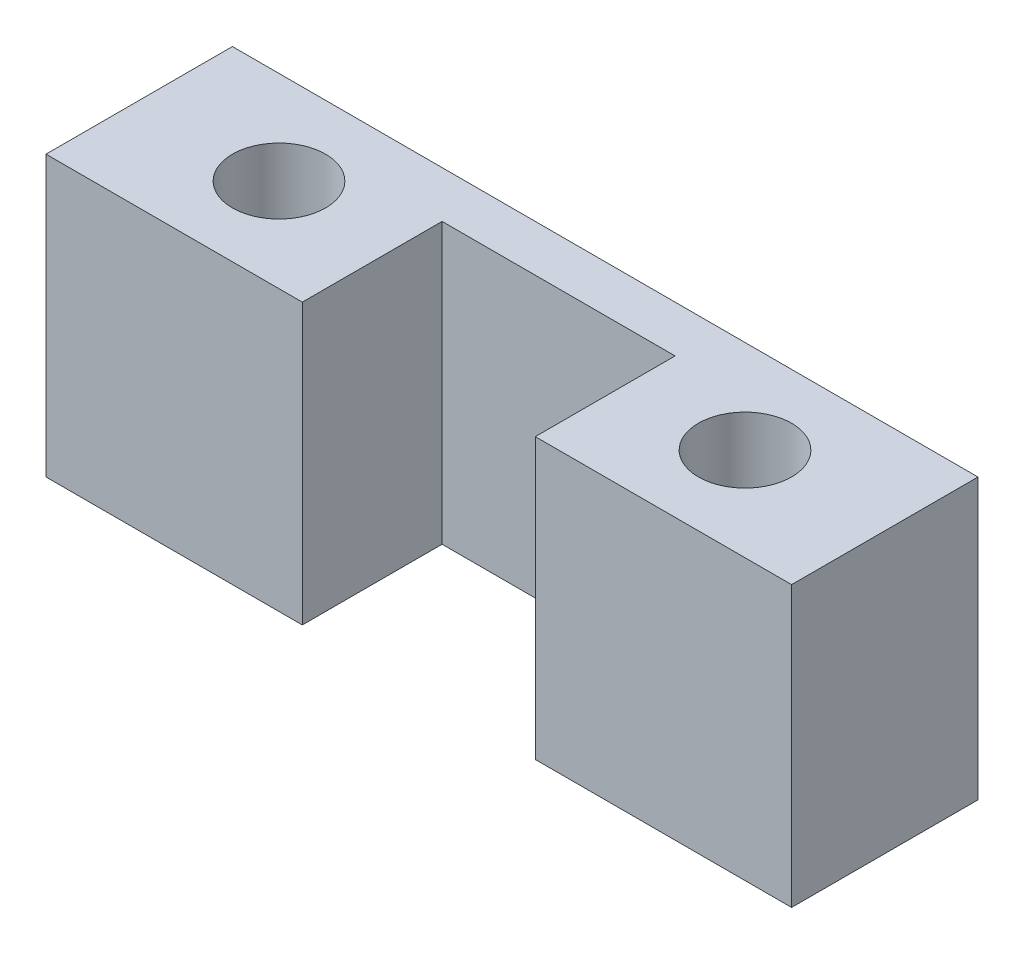
ISO-10303-21;
HEADER;
FILE_DESCRIPTION(('STEP AP214'),'2;1');
FILE_NAME('part.step','',(''),(''),'','','');
FILE_SCHEMA(('AUTOMOTIVE_DESIGN { 1 0 10303 214 1 1 1 1 }'));
ENDSEC;
DATA;
#1=APPLICATION_CONTEXT('core data for automotive mechanical design processes');
#2=APPLICATION_PROTOCOL_DEFINITION('international standard','automotive_design',2000,#1);
#3=PRODUCT_CONTEXT('',#1,'mechanical');
#4=PRODUCT('Part','Part','',(#3));
#5=PRODUCT_RELATED_PRODUCT_CATEGORY('part','',(#4));
#6=PRODUCT_DEFINITION_FORMATION('','',#4);
#7=PRODUCT_DEFINITION_CONTEXT('part definition',#1,'design');
#8=PRODUCT_DEFINITION('design','',#6,#7);
#9=PRODUCT_DEFINITION_SHAPE('','',#8);
#10=(LENGTH_UNIT() NAMED_UNIT(*) SI_UNIT(.MILLI.,.METRE.));
#11=(NAMED_UNIT(*) PLANE_ANGLE_UNIT() SI_UNIT($,.RADIAN.));
#12=(NAMED_UNIT(*) SI_UNIT($,.STERADIAN.) SOLID_ANGLE_UNIT());
#13=UNCERTAINTY_MEASURE_WITH_UNIT(LENGTH_MEASURE(1.E-05),#10,'distance_accuracy_value','');
#14=(GEOMETRIC_REPRESENTATION_CONTEXT(3) GLOBAL_UNCERTAINTY_ASSIGNED_CONTEXT((#13)) GLOBAL_UNIT_ASSIGNED_CONTEXT((#10,
#11,#12)) REPRESENTATION_CONTEXT('',''));
#15=CARTESIAN_POINT('',(0.,0.,0.));
#16=DIRECTION('',(0.,0.,1.));
#17=DIRECTION('',(1.,0.,0.));
#18=AXIS2_PLACEMENT_3D('',#15,#16,#17);
#19=CARTESIAN_POINT('',(-25.4,19.05,6.35));
#20=DIRECTION('',(0.,0.,-1.));
#21=DIRECTION('',(-1.,0.,0.));
#22=AXIS2_PLACEMENT_3D('',#19,#20,#21);
#23=PLANE('',#22);
#24=DIRECTION('',(1.,0.,0.));
#25=VECTOR('',#24,1.);
#26=CARTESIAN_POINT('',(-25.4,0.,6.35));
#27=LINE('',#26,#25);
#28=CARTESIAN_POINT('',(-25.4,0.,6.35));
#29=VERTEX_POINT('',#28);
#30=CARTESIAN_POINT('',(-7.9375,0.,6.35));
#31=VERTEX_POINT('',#30);
#32=EDGE_CURVE('E132',#29,#31,#27,.T.);
#33=ORIENTED_EDGE('',*,*,#32,.T.);
#34=DIRECTION('',(0.,1.,0.));
#35=VECTOR('',#34,1.);
#36=CARTESIAN_POINT('',(-7.9375,0.,6.35));
#37=LINE('',#36,#35);
#38=CARTESIAN_POINT('',(-7.9375,19.05,6.35));
#39=VERTEX_POINT('',#38);
#40=EDGE_CURVE('E115',#31,#39,#37,.T.);
#41=ORIENTED_EDGE('',*,*,#40,.T.);
#42=DIRECTION('',(1.,0.,0.));
#43=VECTOR('',#42,1.);
#44=CARTESIAN_POINT('',(-25.4,19.05,6.35));
#45=LINE('',#44,#43);
#46=CARTESIAN_POINT('',(-25.4,19.05,6.35));
#47=VERTEX_POINT('',#46);
#48=EDGE_CURVE('E154',#47,#39,#45,.T.);
#49=ORIENTED_EDGE('',*,*,#48,.F.);
#50=DIRECTION('',(0.,-1.,0.));
#51=VECTOR('',#50,1.);
#52=CARTESIAN_POINT('',(-25.4,19.05,6.35));
#53=LINE('',#52,#51);
#54=EDGE_CURVE('E140',#47,#29,#53,.T.);
#55=ORIENTED_EDGE('',*,*,#54,.T.);
#56=EDGE_LOOP('',(#33,#41,#49,#55));
#57=FACE_BOUND('',#56,.T.);
#58=ADVANCED_FACE('F39',(#57),#23,.F.);
#59=CARTESIAN_POINT('',(25.4,19.05,6.35));
#60=DIRECTION('',(-1.,0.,0.));
#61=DIRECTION('',(0.,0.,1.));
#62=AXIS2_PLACEMENT_3D('',#59,#60,#61);
#63=PLANE('',#62);
#64=DIRECTION('',(0.,0.,-1.));
#65=VECTOR('',#64,1.);
#66=CARTESIAN_POINT('',(25.4,0.,6.35));
#67=LINE('',#66,#65);
#68=CARTESIAN_POINT('',(25.4,0.,6.35));
#69=VERTEX_POINT('',#68);
#70=CARTESIAN_POINT('',(25.4,0.,-6.35));
#71=VERTEX_POINT('',#70);
#72=EDGE_CURVE('E166',#69,#71,#67,.T.);
#73=ORIENTED_EDGE('',*,*,#72,.T.);
#74=DIRECTION('',(0.,-1.,0.));
#75=VECTOR('',#74,1.);
#76=CARTESIAN_POINT('',(25.4,19.05,-6.35));
#77=LINE('',#76,#75);
#78=CARTESIAN_POINT('',(25.4,19.05,-6.35));
#79=VERTEX_POINT('',#78);
#80=EDGE_CURVE('E11',#79,#71,#77,.T.);
#81=ORIENTED_EDGE('',*,*,#80,.F.);
#82=DIRECTION('',(0.,0.,-1.));
#83=VECTOR('',#82,1.);
#84=CARTESIAN_POINT('',(25.4,19.05,6.35));
#85=LINE('',#84,#83);
#86=CARTESIAN_POINT('',(25.4,19.05,6.35));
#87=VERTEX_POINT('',#86);
#88=EDGE_CURVE('E142',#87,#79,#85,.T.);
#89=ORIENTED_EDGE('',*,*,#88,.F.);
#90=DIRECTION('',(0.,-1.,0.));
#91=VECTOR('',#90,1.);
#92=CARTESIAN_POINT('',(25.4,19.05,6.35));
#93=LINE('',#92,#91);
#94=EDGE_CURVE('E151',#87,#69,#93,.T.);
#95=ORIENTED_EDGE('',*,*,#94,.T.);
#96=EDGE_LOOP('',(#73,#81,#89,#95));
#97=FACE_BOUND('',#96,.T.);
#98=ADVANCED_FACE('F41',(#97),#63,.F.);
#99=CARTESIAN_POINT('',(-25.4,19.05,-6.35));
#100=DIRECTION('',(0.,0.,1.));
#101=DIRECTION('',(1.,0.,0.));
#102=AXIS2_PLACEMENT_3D('',#99,#100,#101);
#103=PLANE('',#102);
#104=DIRECTION('',(-1.,0.,0.));
#105=VECTOR('',#104,1.);
#106=CARTESIAN_POINT('',(-25.4,0.,-6.35));
#107=LINE('',#106,#105);
#108=CARTESIAN_POINT('',(-25.4,0.,-6.35));
#109=VERTEX_POINT('',#108);
#110=EDGE_CURVE('E163',#71,#109,#107,.T.);
#111=ORIENTED_EDGE('',*,*,#110,.T.);
#112=DIRECTION('',(0.,-1.,0.));
#113=VECTOR('',#112,1.);
#114=CARTESIAN_POINT('',(-25.4,19.05,-6.35));
#115=LINE('',#114,#113);
#116=CARTESIAN_POINT('',(-25.4,19.05,-6.35));
#117=VERTEX_POINT('',#116);
#118=EDGE_CURVE('E48',#117,#109,#115,.T.);
#119=ORIENTED_EDGE('',*,*,#118,.F.);
#120=DIRECTION('',(-1.,0.,0.));
#121=VECTOR('',#120,1.);
#122=CARTESIAN_POINT('',(-25.4,19.05,-6.35));
#123=LINE('',#122,#121);
#124=EDGE_CURVE('E93',#79,#117,#123,.T.);
#125=ORIENTED_EDGE('',*,*,#124,.F.);
#126=ORIENTED_EDGE('',*,*,#80,.T.);
#127=EDGE_LOOP('',(#111,#119,#125,#126));
#128=FACE_BOUND('',#127,.T.);
#129=ADVANCED_FACE('F237',(#128),#103,.F.);
#130=CARTESIAN_POINT('',(-25.4,19.05,6.35));
#131=DIRECTION('',(1.,0.,0.));
#132=DIRECTION('',(0.,0.,-1.));
#133=AXIS2_PLACEMENT_3D('',#130,#131,#132);
#134=PLANE('',#133);
#135=DIRECTION('',(0.,0.,1.));
#136=VECTOR('',#135,1.);
#137=CARTESIAN_POINT('',(-25.4,0.,6.35));
#138=LINE('',#137,#136);
#139=EDGE_CURVE('E147',#109,#29,#138,.T.);
#140=ORIENTED_EDGE('',*,*,#139,.T.);
#141=ORIENTED_EDGE('',*,*,#54,.F.);
#142=DIRECTION('',(0.,0.,1.));
#143=VECTOR('',#142,1.);
#144=CARTESIAN_POINT('',(-25.4,19.05,6.35));
#145=LINE('',#144,#143);
#146=EDGE_CURVE('E161',#117,#47,#145,.T.);
#147=ORIENTED_EDGE('',*,*,#146,.F.);
#148=ORIENTED_EDGE('',*,*,#118,.T.);
#149=EDGE_LOOP('',(#140,#141,#147,#148));
#150=FACE_BOUND('',#149,.T.);
#151=ADVANCED_FACE('F160',(#150),#134,.F.);
#152=CARTESIAN_POINT('',(7.9375,19.05,6.35));
#153=VERTEX_POINT('',#152);
#154=EDGE_CURVE('E64',#153,#87,#45,.T.);
#155=ORIENTED_EDGE('',*,*,#154,.F.);
#156=DIRECTION('',(0.,1.,0.));
#157=VECTOR('',#156,1.);
#158=CARTESIAN_POINT('',(7.9375,0.,6.35));
#159=LINE('',#158,#157);
#160=CARTESIAN_POINT('',(7.9375,0.,6.35));
#161=VERTEX_POINT('',#160);
#162=EDGE_CURVE('E126',#161,#153,#159,.T.);
#163=ORIENTED_EDGE('',*,*,#162,.F.);
#164=EDGE_CURVE('E86',#161,#69,#27,.T.);
#165=ORIENTED_EDGE('',*,*,#164,.T.);
#166=ORIENTED_EDGE('',*,*,#94,.F.);
#167=EDGE_LOOP('',(#155,#163,#165,#166));
#168=FACE_BOUND('',#167,.T.);
#169=ADVANCED_FACE('F215',(#168),#23,.F.);
#170=CARTESIAN_POINT('',(0.,19.05,0.));
#171=DIRECTION('',(0.,-1.,0.));
#172=DIRECTION('',(0.,0.,-1.));
#173=AXIS2_PLACEMENT_3D('',#170,#171,#172);
#174=PLANE('',#173);
#175=CARTESIAN_POINT('',(-15.875,19.05,0.));
#176=DIRECTION('',(0.,1.,0.));
#177=DIRECTION('',(0.,0.,1.));
#178=AXIS2_PLACEMENT_3D('',#175,#176,#177);
#179=CIRCLE('',#178,3.175);
#180=CARTESIAN_POINT('',(-15.875,19.05,3.175));
#181=VERTEX_POINT('',#180);
#182=EDGE_CURVE('E187',#181,#181,#179,.T.);
#183=ORIENTED_EDGE('',*,*,#182,.F.);
#184=EDGE_LOOP('',(#183));
#185=FACE_BOUND('',#184,.T.);
#186=CARTESIAN_POINT('',(15.875,19.05,0.));
#187=DIRECTION('',(0.,1.,0.));
#188=DIRECTION('',(0.,0.,1.));
#189=AXIS2_PLACEMENT_3D('',#186,#187,#188);
#190=CIRCLE('',#189,3.175);
#191=CARTESIAN_POINT('',(15.875,19.05,3.175));
#192=VERTEX_POINT('',#191);
#193=EDGE_CURVE('E178',#192,#192,#190,.T.);
#194=ORIENTED_EDGE('',*,*,#193,.F.);
#195=EDGE_LOOP('',(#194));
#196=FACE_BOUND('',#195,.T.);
#197=ORIENTED_EDGE('',*,*,#48,.T.);
#198=DIRECTION('',(0.,0.,1.));
#199=VECTOR('',#198,1.);
#200=CARTESIAN_POINT('',(-7.9375,19.05,6.35));
#201=LINE('',#200,#199);
#202=CARTESIAN_POINT('',(-7.9375,19.05,-3.175));
#203=VERTEX_POINT('',#202);
#204=EDGE_CURVE('E120',#203,#39,#201,.T.);
#205=ORIENTED_EDGE('',*,*,#204,.F.);
#206=DIRECTION('',(-1.,0.,0.));
#207=VECTOR('',#206,1.);
#208=CARTESIAN_POINT('',(-7.9375,19.05,-3.175));
#209=LINE('',#208,#207);
#210=CARTESIAN_POINT('',(7.9375,19.05,-3.175));
#211=VERTEX_POINT('',#210);
#212=EDGE_CURVE('E136',#211,#203,#209,.T.);
#213=ORIENTED_EDGE('',*,*,#212,.F.);
#214=DIRECTION('',(0.,0.,-1.));
#215=VECTOR('',#214,1.);
#216=CARTESIAN_POINT('',(7.9375,19.05,6.35));
#217=LINE('',#216,#215);
#218=EDGE_CURVE('E204',#153,#211,#217,.T.);
#219=ORIENTED_EDGE('',*,*,#218,.F.);
#220=ORIENTED_EDGE('',*,*,#154,.T.);
#221=ORIENTED_EDGE('',*,*,#88,.T.);
#222=ORIENTED_EDGE('',*,*,#124,.T.);
#223=ORIENTED_EDGE('',*,*,#146,.T.);
#224=EDGE_LOOP('',(#197,#205,#213,#219,#220,#221,#222,#223));
#225=FACE_BOUND('',#224,.T.);
#226=ADVANCED_FACE('F220',(#185,#196,#225),#174,.F.);
#227=CARTESIAN_POINT('',(0.,0.,0.));
#228=DIRECTION('',(0.,-1.,0.));
#229=DIRECTION('',(0.,0.,-1.));
#230=AXIS2_PLACEMENT_3D('',#227,#228,#229);
#231=PLANE('',#230);
#232=DIRECTION('',(0.,0.,1.));
#233=VECTOR('',#232,1.);
#234=CARTESIAN_POINT('',(-7.9375,0.,6.35));
#235=LINE('',#234,#233);
#236=CARTESIAN_POINT('',(-7.9375,0.,-3.175));
#237=VERTEX_POINT('',#236);
#238=EDGE_CURVE('E118',#237,#31,#235,.T.);
#239=ORIENTED_EDGE('',*,*,#238,.T.);
#240=ORIENTED_EDGE('',*,*,#32,.F.);
#241=ORIENTED_EDGE('',*,*,#139,.F.);
#242=ORIENTED_EDGE('',*,*,#110,.F.);
#243=ORIENTED_EDGE('',*,*,#72,.F.);
#244=ORIENTED_EDGE('',*,*,#164,.F.);
#245=DIRECTION('',(0.,0.,-1.));
#246=VECTOR('',#245,1.);
#247=CARTESIAN_POINT('',(7.9375,0.,6.35));
#248=LINE('',#247,#246);
#249=CARTESIAN_POINT('',(7.9375,0.,-3.175));
#250=VERTEX_POINT('',#249);
#251=EDGE_CURVE('E135',#161,#250,#248,.T.);
#252=ORIENTED_EDGE('',*,*,#251,.T.);
#253=DIRECTION('',(-1.,0.,0.));
#254=VECTOR('',#253,1.);
#255=CARTESIAN_POINT('',(-7.9375,0.,-3.175));
#256=LINE('',#255,#254);
#257=EDGE_CURVE('E55',#250,#237,#256,.T.);
#258=ORIENTED_EDGE('',*,*,#257,.T.);
#259=EDGE_LOOP('',(#239,#240,#241,#242,#243,#244,#252,#258));
#260=FACE_BOUND('',#259,.T.);
#261=ADVANCED_FACE('F130',(#260),#231,.T.);
#262=CARTESIAN_POINT('',(15.875,3.175,0.));
#263=DIRECTION('',(0.,1.,0.));
#264=DIRECTION('',(0.,0.,1.));
#265=AXIS2_PLACEMENT_3D('',#262,#263,#264);
#266=CYLINDRICAL_SURFACE('',#265,3.175);
#267=CARTESIAN_POINT('',(15.875,3.175,0.));
#268=DIRECTION('',(0.,1.,0.));
#269=DIRECTION('',(0.,0.,1.));
#270=AXIS2_PLACEMENT_3D('',#267,#268,#269);
#271=CIRCLE('',#270,3.175);
#272=CARTESIAN_POINT('',(15.875,3.175,3.175));
#273=VERTEX_POINT('',#272);
#274=EDGE_CURVE('E182',#273,#273,#271,.T.);
#275=ORIENTED_EDGE('',*,*,#274,.F.);
#276=EDGE_LOOP('',(#275));
#277=FACE_BOUND('',#276,.T.);
#278=ORIENTED_EDGE('',*,*,#193,.T.);
#279=EDGE_LOOP('',(#278));
#280=FACE_BOUND('',#279,.T.);
#281=ADVANCED_FACE('F282',(#277,#280),#266,.F.);
#282=CARTESIAN_POINT('',(15.875,3.175,0.));
#283=DIRECTION('',(0.,1.,0.));
#284=DIRECTION('',(0.,0.,1.));
#285=AXIS2_PLACEMENT_3D('',#282,#283,#284);
#286=PLANE('',#285);
#287=ORIENTED_EDGE('',*,*,#274,.T.);
#288=EDGE_LOOP('',(#287));
#289=FACE_BOUND('',#288,.T.);
#290=ADVANCED_FACE('F289',(#289),#286,.T.);
#291=CARTESIAN_POINT('',(-15.875,3.175,0.));
#292=DIRECTION('',(0.,1.,0.));
#293=DIRECTION('',(0.,0.,1.));
#294=AXIS2_PLACEMENT_3D('',#291,#292,#293);
#295=CYLINDRICAL_SURFACE('',#294,3.175);
#296=CARTESIAN_POINT('',(-15.875,3.175,0.));
#297=DIRECTION('',(0.,1.,0.));
#298=DIRECTION('',(0.,0.,1.));
#299=AXIS2_PLACEMENT_3D('',#296,#297,#298);
#300=CIRCLE('',#299,3.175);
#301=CARTESIAN_POINT('',(-15.875,3.175,3.175));
#302=VERTEX_POINT('',#301);
#303=EDGE_CURVE('E169',#302,#302,#300,.T.);
#304=ORIENTED_EDGE('',*,*,#303,.F.);
#305=EDGE_LOOP('',(#304));
#306=FACE_BOUND('',#305,.T.);
#307=ORIENTED_EDGE('',*,*,#182,.T.);
#308=EDGE_LOOP('',(#307));
#309=FACE_BOUND('',#308,.T.);
#310=ADVANCED_FACE('F298',(#306,#309),#295,.F.);
#311=CARTESIAN_POINT('',(-15.875,3.175,0.));
#312=DIRECTION('',(0.,1.,0.));
#313=DIRECTION('',(0.,0.,1.));
#314=AXIS2_PLACEMENT_3D('',#311,#312,#313);
#315=PLANE('',#314);
#316=ORIENTED_EDGE('',*,*,#303,.T.);
#317=EDGE_LOOP('',(#316));
#318=FACE_BOUND('',#317,.T.);
#319=ADVANCED_FACE('F230',(#318),#315,.T.);
#320=CARTESIAN_POINT('',(-7.9375,0.,6.35));
#321=DIRECTION('',(-1.,0.,0.));
#322=DIRECTION('',(0.,0.,1.));
#323=AXIS2_PLACEMENT_3D('',#320,#321,#322);
#324=PLANE('',#323);
#325=ORIENTED_EDGE('',*,*,#204,.T.);
#326=ORIENTED_EDGE('',*,*,#40,.F.);
#327=ORIENTED_EDGE('',*,*,#238,.F.);
#328=DIRECTION('',(0.,1.,0.));
#329=VECTOR('',#328,1.);
#330=CARTESIAN_POINT('',(-7.9375,0.,-3.175));
#331=LINE('',#330,#329);
#332=EDGE_CURVE('E183',#237,#203,#331,.T.);
#333=ORIENTED_EDGE('',*,*,#332,.T.);
#334=EDGE_LOOP('',(#325,#326,#327,#333));
#335=FACE_BOUND('',#334,.T.);
#336=ADVANCED_FACE('F117',(#335),#324,.F.);
#337=CARTESIAN_POINT('',(-7.9375,0.,-3.175));
#338=DIRECTION('',(0.,0.,-1.));
#339=DIRECTION('',(-1.,0.,0.));
#340=AXIS2_PLACEMENT_3D('',#337,#338,#339);
#341=PLANE('',#340);
#342=ORIENTED_EDGE('',*,*,#212,.T.);
#343=ORIENTED_EDGE('',*,*,#332,.F.);
#344=ORIENTED_EDGE('',*,*,#257,.F.);
#345=DIRECTION('',(0.,1.,0.));
#346=VECTOR('',#345,1.);
#347=CARTESIAN_POINT('',(7.9375,0.,-3.175));
#348=LINE('',#347,#346);
#349=EDGE_CURVE('E196',#250,#211,#348,.T.);
#350=ORIENTED_EDGE('',*,*,#349,.T.);
#351=EDGE_LOOP('',(#342,#343,#344,#350));
#352=FACE_BOUND('',#351,.T.);
#353=ADVANCED_FACE('F222',(#352),#341,.F.);
#354=CARTESIAN_POINT('',(7.9375,0.,6.35));
#355=DIRECTION('',(1.,0.,0.));
#356=DIRECTION('',(0.,0.,-1.));
#357=AXIS2_PLACEMENT_3D('',#354,#355,#356);
#358=PLANE('',#357);
#359=ORIENTED_EDGE('',*,*,#218,.T.);
#360=ORIENTED_EDGE('',*,*,#349,.F.);
#361=ORIENTED_EDGE('',*,*,#251,.F.);
#362=ORIENTED_EDGE('',*,*,#162,.T.);
#363=EDGE_LOOP('',(#359,#360,#361,#362));
#364=FACE_BOUND('',#363,.T.);
#365=ADVANCED_FACE('F214',(#364),#358,.F.);
#366=CLOSED_SHELL('',(#58,#98,#129,#151,#169,#226,#261,#281,#290,#310,#319,#336,#353,#365));
#367=MANIFOLD_SOLID_BREP('B2',#366);
#368=ADVANCED_BREP_SHAPE_REPRESENTATION('',(#18,#367),#14);
#369=SHAPE_DEFINITION_REPRESENTATION(#9,#368);
ENDSEC;
END-ISO-10303-21;
